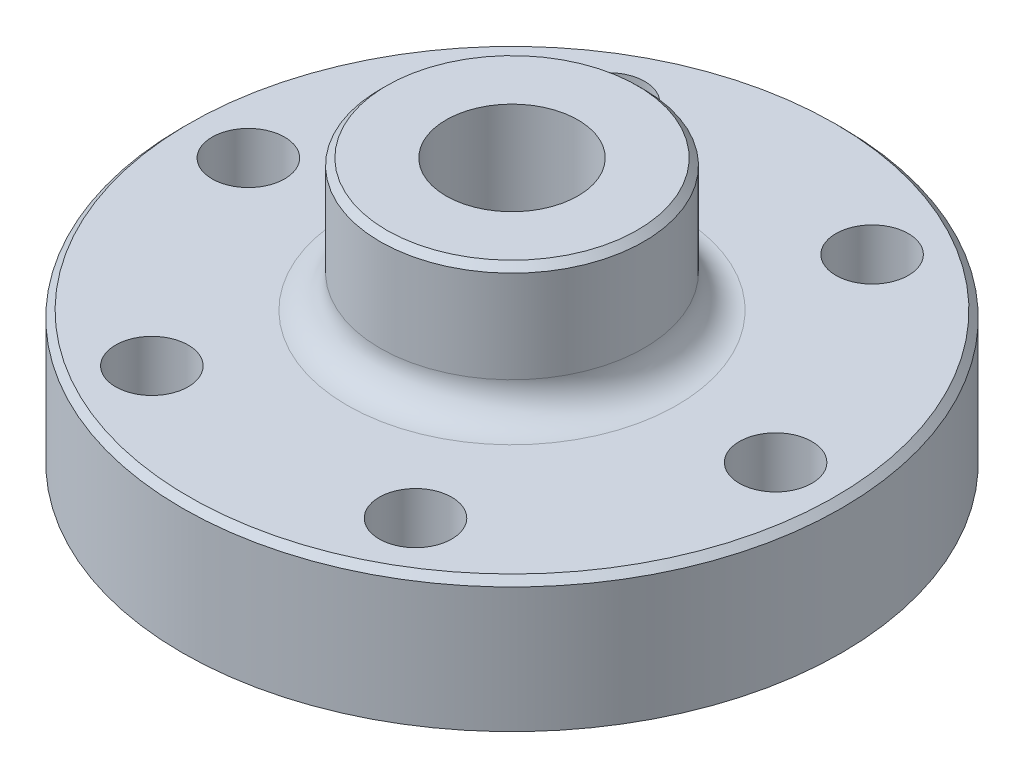
ISO-10303-21;
HEADER;
FILE_DESCRIPTION(('STEP AP214'),'2;1');
FILE_NAME('part.step','',(''),(''),'','','');
FILE_SCHEMA(('AUTOMOTIVE_DESIGN { 1 0 10303 214 1 1 1 1 }'));
ENDSEC;
DATA;
#1=APPLICATION_CONTEXT('core data for automotive mechanical design processes');
#2=APPLICATION_PROTOCOL_DEFINITION('international standard','automotive_design',2000,#1);
#3=PRODUCT_CONTEXT('',#1,'mechanical');
#4=PRODUCT('Part','Part','',(#3));
#5=PRODUCT_RELATED_PRODUCT_CATEGORY('part','',(#4));
#6=PRODUCT_DEFINITION_FORMATION('','',#4);
#7=PRODUCT_DEFINITION_CONTEXT('part definition',#1,'design');
#8=PRODUCT_DEFINITION('design','',#6,#7);
#9=PRODUCT_DEFINITION_SHAPE('','',#8);
#10=(LENGTH_UNIT() NAMED_UNIT(*) SI_UNIT(.MILLI.,.METRE.));
#11=(NAMED_UNIT(*) PLANE_ANGLE_UNIT() SI_UNIT($,.RADIAN.));
#12=(NAMED_UNIT(*) SI_UNIT($,.STERADIAN.) SOLID_ANGLE_UNIT());
#13=UNCERTAINTY_MEASURE_WITH_UNIT(LENGTH_MEASURE(1.E-05),#10,'distance_accuracy_value','');
#14=(GEOMETRIC_REPRESENTATION_CONTEXT(3) GLOBAL_UNCERTAINTY_ASSIGNED_CONTEXT((#13)) GLOBAL_UNIT_ASSIGNED_CONTEXT((#10,
#11,#12)) REPRESENTATION_CONTEXT('',''));
#15=CARTESIAN_POINT('',(0.,0.,0.));
#16=DIRECTION('',(0.,0.,1.));
#17=DIRECTION('',(1.,0.,0.));
#18=AXIS2_PLACEMENT_3D('',#15,#16,#17);
#19=CARTESIAN_POINT('',(0.,698.5,0.));
#20=DIRECTION('',(0.,1.,0.));
#21=DIRECTION('',(0.,0.,1.));
#22=AXIS2_PLACEMENT_3D('',#19,#20,#21);
#23=TOROIDAL_SURFACE('',#22,635.,127.);
#24=CARTESIAN_POINT('',(0.,571.5,0.));
#25=DIRECTION('',(0.,1.,0.));
#26=DIRECTION('',(0.,0.,1.));
#27=AXIS2_PLACEMENT_3D('',#24,#25,#26);
#28=CIRCLE('',#27,635.);
#29=CARTESIAN_POINT('',(0.,571.5,635.));
#30=VERTEX_POINT('',#29);
#31=EDGE_CURVE('E62',#30,#30,#28,.F.);
#32=ORIENTED_EDGE('',*,*,#31,.F.);
#33=EDGE_LOOP('',(#32));
#34=FACE_BOUND('',#33,.T.);
#35=CARTESIAN_POINT('',(0.,698.5,0.));
#36=DIRECTION('',(0.,1.,0.));
#37=DIRECTION('',(0.,0.,1.));
#38=AXIS2_PLACEMENT_3D('',#35,#36,#37);
#39=CIRCLE('',#38,508.);
#40=CARTESIAN_POINT('',(0.,698.5,508.));
#41=VERTEX_POINT('',#40);
#42=EDGE_CURVE('E57',#41,#41,#39,.T.);
#43=ORIENTED_EDGE('',*,*,#42,.F.);
#44=EDGE_LOOP('',(#43));
#45=FACE_BOUND('',#44,.T.);
#46=ADVANCED_FACE('F43',(#34,#45),#23,.F.);
#47=CARTESIAN_POINT('',(0.,571.5,0.));
#48=DIRECTION('',(0.,-1.,0.));
#49=DIRECTION('',(0.,0.,-1.));
#50=AXIS2_PLACEMENT_3D('',#47,#48,#49);
#51=CYLINDRICAL_SURFACE('',#50,1270.);
#52=CARTESIAN_POINT('',(0.,546.1,0.));
#53=DIRECTION('',(0.,1.,0.));
#54=DIRECTION('',(0.,0.,1.));
#55=AXIS2_PLACEMENT_3D('',#52,#53,#54);
#56=CIRCLE('',#55,1270.);
#57=CARTESIAN_POINT('',(0.,546.1,-1270.));
#58=VERTEX_POINT('',#57);
#59=EDGE_CURVE('E68',#58,#58,#56,.F.);
#60=ORIENTED_EDGE('',*,*,#59,.T.);
#61=EDGE_LOOP('',(#60));
#62=FACE_BOUND('',#61,.T.);
#63=CARTESIAN_POINT('',(0.,63.5,0.));
#64=DIRECTION('',(0.,1.,0.));
#65=DIRECTION('',(0.,0.,1.));
#66=AXIS2_PLACEMENT_3D('',#63,#64,#65);
#67=CIRCLE('',#66,1270.);
#68=CARTESIAN_POINT('',(0.,63.5,1270.));
#69=VERTEX_POINT('',#68);
#70=EDGE_CURVE('E115',#69,#69,#67,.T.);
#71=ORIENTED_EDGE('',*,*,#70,.T.);
#72=EDGE_LOOP('',(#71));
#73=FACE_BOUND('',#72,.T.);
#74=ADVANCED_FACE('F160',(#62,#73),#51,.T.);
#75=CARTESIAN_POINT('',(0.,571.5,0.));
#76=DIRECTION('',(0.,1.,0.));
#77=DIRECTION('',(0.,0.,1.));
#78=AXIS2_PLACEMENT_3D('',#75,#76,#77);
#79=PLANE('',#78);
#80=ORIENTED_EDGE('',*,*,#31,.T.);
#81=EDGE_LOOP('',(#80));
#82=FACE_BOUND('',#81,.T.);
#83=CARTESIAN_POINT('',(-1015.47879585485,571.5,2.27281067831809E-11));
#84=DIRECTION('',(0.,1.,0.));
#85=DIRECTION('',(0.,0.,1.));
#86=AXIS2_PLACEMENT_3D('',#83,#84,#85);
#87=CIRCLE('',#86,139.700000000025);
#88=CARTESIAN_POINT('',(-1015.47879585485,571.5,139.700000000048));
#89=VERTEX_POINT('',#88);
#90=EDGE_CURVE('E73',#89,#89,#87,.F.);
#91=ORIENTED_EDGE('',*,*,#90,.T.);
#92=EDGE_LOOP('',(#91));
#93=FACE_BOUND('',#92,.T.);
#94=CARTESIAN_POINT('',(-507.739397927369,571.5,879.430434214766));
#95=DIRECTION('',(0.,1.,0.));
#96=DIRECTION('',(0.,0.,1.));
#97=AXIS2_PLACEMENT_3D('',#94,#95,#96);
#98=CIRCLE('',#97,139.700000000065);
#99=CARTESIAN_POINT('',(-507.739397927369,571.5,1019.13043421483));
#100=VERTEX_POINT('',#99);
#101=EDGE_CURVE('E74',#100,#100,#98,.F.);
#102=ORIENTED_EDGE('',*,*,#101,.T.);
#103=EDGE_LOOP('',(#102));
#104=FACE_BOUND('',#103,.T.);
#105=CARTESIAN_POINT('',(507.73939792752,571.5,879.430434214723));
#106=DIRECTION('',(0.,1.,0.));
#107=DIRECTION('',(0.,0.,1.));
#108=AXIS2_PLACEMENT_3D('',#105,#106,#107);
#109=CIRCLE('',#108,139.700000000092);
#110=CARTESIAN_POINT('',(507.73939792752,571.5,1019.13043421481));
#111=VERTEX_POINT('',#110);
#112=EDGE_CURVE('E79',#111,#111,#109,.F.);
#113=ORIENTED_EDGE('',*,*,#112,.T.);
#114=EDGE_LOOP('',(#113));
#115=FACE_BOUND('',#114,.T.);
#116=CARTESIAN_POINT('',(1015.47879585493,571.5,-6.48055594164743E-11));
#117=DIRECTION('',(0.,1.,0.));
#118=DIRECTION('',(0.,0.,1.));
#119=AXIS2_PLACEMENT_3D('',#116,#117,#118);
#120=CIRCLE('',#119,139.700000000076);
#121=CARTESIAN_POINT('',(1015.47879585493,571.5,139.700000000011));
#122=VERTEX_POINT('',#121);
#123=EDGE_CURVE('E84',#122,#122,#120,.F.);
#124=ORIENTED_EDGE('',*,*,#123,.T.);
#125=EDGE_LOOP('',(#124));
#126=FACE_BOUND('',#125,.T.);
#127=CARTESIAN_POINT('',(507.739397927444,571.5,-879.430434214809));
#128=DIRECTION('',(0.,1.,0.));
#129=DIRECTION('',(0.,0.,1.));
#130=AXIS2_PLACEMENT_3D('',#127,#128,#129);
#131=CIRCLE('',#130,139.700000000032);
#132=CARTESIAN_POINT('',(507.739397927444,571.5,-739.730434214777));
#133=VERTEX_POINT('',#132);
#134=EDGE_CURVE('E89',#133,#133,#131,.F.);
#135=ORIENTED_EDGE('',*,*,#134,.T.);
#136=EDGE_LOOP('',(#135));
#137=FACE_BOUND('',#136,.T.);
#138=CARTESIAN_POINT('',(-507.739397927444,571.5,-879.430434214765));
#139=DIRECTION('',(0.,1.,0.));
#140=DIRECTION('',(0.,0.,1.));
#141=AXIS2_PLACEMENT_3D('',#138,#139,#140);
#142=CIRCLE('',#141,139.7);
#143=CARTESIAN_POINT('',(-507.739397927444,571.5,-739.730434214765));
#144=VERTEX_POINT('',#143);
#145=EDGE_CURVE('E94',#144,#144,#142,.F.);
#146=ORIENTED_EDGE('',*,*,#145,.T.);
#147=EDGE_LOOP('',(#146));
#148=FACE_BOUND('',#147,.T.);
#149=CARTESIAN_POINT('',(0.,571.5,0.));
#150=DIRECTION('',(0.,1.,0.));
#151=DIRECTION('',(0.,0.,1.));
#152=AXIS2_PLACEMENT_3D('',#149,#150,#151);
#153=CIRCLE('',#152,1244.6);
#154=CARTESIAN_POINT('',(0.,571.5,-1244.6));
#155=VERTEX_POINT('',#154);
#156=EDGE_CURVE('E103',#155,#155,#153,.T.);
#157=ORIENTED_EDGE('',*,*,#156,.T.);
#158=EDGE_LOOP('',(#157));
#159=FACE_BOUND('',#158,.T.);
#160=ADVANCED_FACE('F165',(#82,#93,#104,#115,#126,#137,#148,#159),#79,.T.);
#161=CARTESIAN_POINT('',(0.,0.,0.));
#162=DIRECTION('',(0.,1.,0.));
#163=DIRECTION('',(0.,0.,1.));
#164=AXIS2_PLACEMENT_3D('',#161,#162,#163);
#165=CYLINDRICAL_SURFACE('',#164,762.);
#166=CARTESIAN_POINT('',(0.,63.5,0.));
#167=DIRECTION('',(0.,1.,0.));
#168=DIRECTION('',(0.,0.,1.));
#169=AXIS2_PLACEMENT_3D('',#166,#167,#168);
#170=CIRCLE('',#169,762.);
#171=CARTESIAN_POINT('',(0.,63.5,762.));
#172=VERTEX_POINT('',#171);
#173=EDGE_CURVE('E111',#172,#172,#170,.T.);
#174=ORIENTED_EDGE('',*,*,#173,.F.);
#175=EDGE_LOOP('',(#174));
#176=FACE_BOUND('',#175,.T.);
#177=CARTESIAN_POINT('',(0.,0.,0.));
#178=DIRECTION('',(0.,1.,0.));
#179=DIRECTION('',(0.,0.,1.));
#180=AXIS2_PLACEMENT_3D('',#177,#178,#179);
#181=CIRCLE('',#180,762.);
#182=CARTESIAN_POINT('',(0.,0.,762.));
#183=VERTEX_POINT('',#182);
#184=EDGE_CURVE('E107',#183,#183,#181,.T.);
#185=ORIENTED_EDGE('',*,*,#184,.T.);
#186=EDGE_LOOP('',(#185));
#187=FACE_BOUND('',#186,.T.);
#188=ADVANCED_FACE('F186',(#176,#187),#165,.T.);
#189=CARTESIAN_POINT('',(-1270.,63.5,0.));
#190=DIRECTION('',(0.,1.,0.));
#191=DIRECTION('',(0.,0.,1.));
#192=AXIS2_PLACEMENT_3D('',#189,#190,#191);
#193=PLANE('',#192);
#194=CARTESIAN_POINT('',(-1015.47879585485,63.5,2.27281067831809E-11));
#195=DIRECTION('',(0.,1.,0.));
#196=DIRECTION('',(0.,0.,1.));
#197=AXIS2_PLACEMENT_3D('',#194,#195,#196);
#198=CIRCLE('',#197,139.700000000025);
#199=CARTESIAN_POINT('',(-1015.47879585485,63.5,139.700000000048));
#200=VERTEX_POINT('',#199);
#201=EDGE_CURVE('E69',#200,#200,#198,.F.);
#202=ORIENTED_EDGE('',*,*,#201,.F.);
#203=EDGE_LOOP('',(#202));
#204=FACE_BOUND('',#203,.T.);
#205=CARTESIAN_POINT('',(-507.739397927369,63.5,879.430434214766));
#206=DIRECTION('',(0.,1.,0.));
#207=DIRECTION('',(0.,0.,1.));
#208=AXIS2_PLACEMENT_3D('',#205,#206,#207);
#209=CIRCLE('',#208,139.700000000065);
#210=CARTESIAN_POINT('',(-507.739397927369,63.5,1019.13043421483));
#211=VERTEX_POINT('',#210);
#212=EDGE_CURVE('E75',#211,#211,#209,.F.);
#213=ORIENTED_EDGE('',*,*,#212,.F.);
#214=EDGE_LOOP('',(#213));
#215=FACE_BOUND('',#214,.T.);
#216=CARTESIAN_POINT('',(507.73939792752,63.5,879.430434214723));
#217=DIRECTION('',(0.,1.,0.));
#218=DIRECTION('',(0.,0.,1.));
#219=AXIS2_PLACEMENT_3D('',#216,#217,#218);
#220=CIRCLE('',#219,139.700000000092);
#221=CARTESIAN_POINT('',(507.73939792752,63.5,1019.13043421481));
#222=VERTEX_POINT('',#221);
#223=EDGE_CURVE('E80',#222,#222,#220,.F.);
#224=ORIENTED_EDGE('',*,*,#223,.F.);
#225=EDGE_LOOP('',(#224));
#226=FACE_BOUND('',#225,.T.);
#227=CARTESIAN_POINT('',(1015.47879585493,63.5,-6.48055594164743E-11));
#228=DIRECTION('',(0.,1.,0.));
#229=DIRECTION('',(0.,0.,1.));
#230=AXIS2_PLACEMENT_3D('',#227,#228,#229);
#231=CIRCLE('',#230,139.700000000076);
#232=CARTESIAN_POINT('',(1015.47879585493,63.5,139.700000000011));
#233=VERTEX_POINT('',#232);
#234=EDGE_CURVE('E85',#233,#233,#231,.F.);
#235=ORIENTED_EDGE('',*,*,#234,.F.);
#236=EDGE_LOOP('',(#235));
#237=FACE_BOUND('',#236,.T.);
#238=CARTESIAN_POINT('',(507.739397927444,63.5,-879.430434214809));
#239=DIRECTION('',(0.,1.,0.));
#240=DIRECTION('',(0.,0.,1.));
#241=AXIS2_PLACEMENT_3D('',#238,#239,#240);
#242=CIRCLE('',#241,139.700000000032);
#243=CARTESIAN_POINT('',(507.739397927444,63.5,-739.730434214777));
#244=VERTEX_POINT('',#243);
#245=EDGE_CURVE('E90',#244,#244,#242,.F.);
#246=ORIENTED_EDGE('',*,*,#245,.F.);
#247=EDGE_LOOP('',(#246));
#248=FACE_BOUND('',#247,.T.);
#249=CARTESIAN_POINT('',(-507.739397927444,63.5,-879.430434214765));
#250=DIRECTION('',(0.,1.,0.));
#251=DIRECTION('',(0.,0.,1.));
#252=AXIS2_PLACEMENT_3D('',#249,#250,#251);
#253=CIRCLE('',#252,139.7);
#254=CARTESIAN_POINT('',(-507.739397927444,63.5,-739.730434214765));
#255=VERTEX_POINT('',#254);
#256=EDGE_CURVE('E95',#255,#255,#253,.F.);
#257=ORIENTED_EDGE('',*,*,#256,.F.);
#258=EDGE_LOOP('',(#257));
#259=FACE_BOUND('',#258,.T.);
#260=ORIENTED_EDGE('',*,*,#70,.F.);
#261=EDGE_LOOP('',(#260));
#262=FACE_BOUND('',#261,.T.);
#263=ORIENTED_EDGE('',*,*,#173,.T.);
#264=EDGE_LOOP('',(#263));
#265=FACE_BOUND('',#264,.T.);
#266=ADVANCED_FACE('F182',(#204,#215,#226,#237,#248,#259,#262,#265),#193,.F.);
#267=CARTESIAN_POINT('',(0.,0.,0.));
#268=DIRECTION('',(0.,1.,0.));
#269=DIRECTION('',(0.,0.,1.));
#270=AXIS2_PLACEMENT_3D('',#267,#268,#269);
#271=PLANE('',#270);
#272=CARTESIAN_POINT('',(0.,0.,0.));
#273=DIRECTION('',(0.,1.,0.));
#274=DIRECTION('',(0.,0.,1.));
#275=AXIS2_PLACEMENT_3D('',#272,#273,#274);
#276=CIRCLE('',#275,254.);
#277=CARTESIAN_POINT('',(0.,0.,254.));
#278=VERTEX_POINT('',#277);
#279=EDGE_CURVE('E99',#278,#278,#276,.T.);
#280=ORIENTED_EDGE('',*,*,#279,.T.);
#281=EDGE_LOOP('',(#280));
#282=FACE_BOUND('',#281,.T.);
#283=ORIENTED_EDGE('',*,*,#184,.F.);
#284=EDGE_LOOP('',(#283));
#285=FACE_BOUND('',#284,.T.);
#286=ADVANCED_FACE('F177',(#282,#285),#271,.F.);
#287=CARTESIAN_POINT('',(0.,571.5,0.));
#288=DIRECTION('',(0.,-1.,0.));
#289=DIRECTION('',(0.,0.,-1.));
#290=AXIS2_PLACEMENT_3D('',#287,#288,#289);
#291=CONICAL_SURFACE('',#290,1244.6,0.785398163397444);
#292=CARTESIAN_POINT('',(0.,546.1,-1270.));
#293=CARTESIAN_POINT('',(0.,546.364583333333,-1269.73541666667));
#294=CARTESIAN_POINT('',(0.,546.629166666666,-1269.47083333333));
#295=CARTESIAN_POINT('',(0.,547.158333333333,-1268.94166666667));
#296=CARTESIAN_POINT('',(0.,547.422916666667,-1268.67708333333));
#297=CARTESIAN_POINT('',(0.,547.952083333333,-1268.14791666667));
#298=CARTESIAN_POINT('',(0.,548.216666666667,-1267.88333333333));
#299=CARTESIAN_POINT('',(0.,548.745833333333,-1267.35416666667));
#300=CARTESIAN_POINT('',(0.,549.010416666667,-1267.08958333333));
#301=CARTESIAN_POINT('',(0.,549.539583333333,-1266.56041666667));
#302=CARTESIAN_POINT('',(0.,549.804166666667,-1266.29583333333));
#303=CARTESIAN_POINT('',(0.,550.333333333333,-1265.76666666667));
#304=CARTESIAN_POINT('',(0.,550.597916666667,-1265.50208333333));
#305=CARTESIAN_POINT('',(0.,551.127083333333,-1264.97291666667));
#306=CARTESIAN_POINT('',(0.,551.391666666667,-1264.70833333333));
#307=CARTESIAN_POINT('',(0.,551.920833333333,-1264.17916666667));
#308=CARTESIAN_POINT('',(0.,552.185416666667,-1263.91458333333));
#309=CARTESIAN_POINT('',(0.,552.714583333333,-1263.38541666667));
#310=CARTESIAN_POINT('',(0.,552.979166666667,-1263.12083333333));
#311=CARTESIAN_POINT('',(0.,553.508333333333,-1262.59166666667));
#312=CARTESIAN_POINT('',(0.,553.772916666667,-1262.32708333333));
#313=CARTESIAN_POINT('',(0.,554.302083333333,-1261.79791666667));
#314=CARTESIAN_POINT('',(0.,554.566666666666,-1261.53333333333));
#315=CARTESIAN_POINT('',(0.,555.095833333333,-1261.00416666667));
#316=CARTESIAN_POINT('',(0.,555.360416666667,-1260.73958333333));
#317=CARTESIAN_POINT('',(0.,555.889583333333,-1260.21041666667));
#318=CARTESIAN_POINT('',(0.,556.154166666666,-1259.94583333333));
#319=CARTESIAN_POINT('',(0.,556.683333333333,-1259.41666666667));
#320=CARTESIAN_POINT('',(0.,556.947916666667,-1259.15208333333));
#321=CARTESIAN_POINT('',(0.,557.477083333333,-1258.62291666667));
#322=CARTESIAN_POINT('',(0.,557.741666666667,-1258.35833333333));
#323=CARTESIAN_POINT('',(0.,558.270833333333,-1257.82916666667));
#324=CARTESIAN_POINT('',(0.,558.535416666667,-1257.56458333333));
#325=CARTESIAN_POINT('',(0.,559.064583333333,-1257.03541666667));
#326=CARTESIAN_POINT('',(0.,559.329166666667,-1256.77083333333));
#327=CARTESIAN_POINT('',(0.,559.858333333333,-1256.24166666667));
#328=CARTESIAN_POINT('',(0.,560.122916666667,-1255.97708333333));
#329=CARTESIAN_POINT('',(0.,560.652083333333,-1255.44791666667));
#330=CARTESIAN_POINT('',(0.,560.916666666667,-1255.18333333333));
#331=CARTESIAN_POINT('',(0.,561.445833333333,-1254.65416666667));
#332=CARTESIAN_POINT('',(0.,561.710416666667,-1254.38958333333));
#333=CARTESIAN_POINT('',(0.,562.239583333333,-1253.86041666667));
#334=CARTESIAN_POINT('',(0.,562.504166666667,-1253.59583333333));
#335=CARTESIAN_POINT('',(0.,563.033333333333,-1253.06666666667));
#336=CARTESIAN_POINT('',(0.,563.297916666667,-1252.80208333333));
#337=CARTESIAN_POINT('',(0.,563.827083333333,-1252.27291666667));
#338=CARTESIAN_POINT('',(0.,564.091666666667,-1252.00833333333));
#339=CARTESIAN_POINT('',(0.,564.620833333333,-1251.47916666667));
#340=CARTESIAN_POINT('',(0.,564.885416666667,-1251.21458333333));
#341=CARTESIAN_POINT('',(0.,565.414583333333,-1250.68541666667));
#342=CARTESIAN_POINT('',(0.,565.679166666667,-1250.42083333333));
#343=CARTESIAN_POINT('',(0.,566.208333333333,-1249.89166666667));
#344=CARTESIAN_POINT('',(0.,566.472916666666,-1249.62708333333));
#345=CARTESIAN_POINT('',(0.,567.002083333333,-1249.09791666667));
#346=CARTESIAN_POINT('',(0.,567.266666666667,-1248.83333333333));
#347=CARTESIAN_POINT('',(0.,567.795833333333,-1248.30416666667));
#348=CARTESIAN_POINT('',(0.,568.060416666667,-1248.03958333333));
#349=CARTESIAN_POINT('',(0.,568.589583333333,-1247.51041666667));
#350=CARTESIAN_POINT('',(0.,568.854166666667,-1247.24583333333));
#351=CARTESIAN_POINT('',(0.,569.383333333333,-1246.71666666667));
#352=CARTESIAN_POINT('',(0.,569.647916666667,-1246.45208333333));
#353=CARTESIAN_POINT('',(0.,570.177083333333,-1245.92291666667));
#354=CARTESIAN_POINT('',(0.,570.441666666667,-1245.65833333333));
#355=CARTESIAN_POINT('',(0.,570.970833333333,-1245.12916666667));
#356=CARTESIAN_POINT('',(0.,571.235416666667,-1244.86458333333));
#357=CARTESIAN_POINT('',(0.,571.5,-1244.6));
#358=B_SPLINE_CURVE_WITH_KNOTS('',3,(#292,#293,#294,#295,#296,#297,#298,#299,#300,#301,#302,
#303,#304,#305,#306,#307,#308,#309,#310,#311,#312,#313,#314,#315,#316,#317,#318,#319,#320,#321,
#322,#323,#324,#325,#326,#327,#328,#329,#330,#331,#332,#333,#334,#335,#336,#337,#338,#339,#340,
#341,#342,#343,#344,#345,#346,#347,#348,#349,#350,#351,#352,#353,#354,#355,#356,#357),
.UNSPECIFIED.,.F.,.F.,(4,2,2,2,2,2,2,2,2,2,2,2,2,2,2,2,2,2,2,2,2,2,2,2,2,2,2,2,2,2,2,2,4),(0.,
1.12253201513354,2.24506403026716,3.36759604540094,4.49012806053448,5.61266007566809,
6.73519209080187,7.85772410593541,8.98025612106903,10.1027881362028,11.2253201513363,
12.34785216647,13.4703841816037,14.5929161967373,15.7154482118709,16.8379802270045,
17.9605122421383,19.0830442572718,20.2055762724055,21.3281082875392,22.4506403026728,
23.5731723178064,24.6957043329402,25.8182363480737,26.9407683632073,28.0633003783411,
29.1858323934746,30.3083644086083,31.4308964237419,32.5534284388756,33.6759604540092,
34.7984924691428,35.9210244842766),.UNSPECIFIED.);
#359=EDGE_CURVE('BSEAM172',#58,#155,#358,.T.);
#360=ORIENTED_EDGE('',*,*,#59,.F.);
#361=ORIENTED_EDGE('',*,*,#156,.F.);
#362=ORIENTED_EDGE('',*,*,#359,.T.);
#363=ORIENTED_EDGE('',*,*,#359,.F.);
#364=EDGE_LOOP('',(#360,#362,#361,#363));
#365=FACE_BOUND('',#364,.T.);
#366=ADVANCED_FACE('F172',(#365),#291,.T.);
#367=CARTESIAN_POINT('',(-507.739397927444,1016.,-879.430434214765));
#368=DIRECTION('',(0.,-1.,0.));
#369=DIRECTION('',(0.,0.,-1.));
#370=AXIS2_PLACEMENT_3D('',#367,#368,#369);
#371=CYLINDRICAL_SURFACE('',#370,139.7);
#372=ORIENTED_EDGE('',*,*,#145,.F.);
#373=EDGE_LOOP('',(#372));
#374=FACE_BOUND('',#373,.T.);
#375=ORIENTED_EDGE('',*,*,#256,.T.);
#376=EDGE_LOOP('',(#375));
#377=FACE_BOUND('',#376,.T.);
#378=ADVANCED_FACE('F176',(#374,#377),#371,.F.);
#379=CARTESIAN_POINT('',(507.739397927444,1016.,-879.430434214809));
#380=DIRECTION('',(0.,-1.,0.));
#381=DIRECTION('',(0.,0.,-1.));
#382=AXIS2_PLACEMENT_3D('',#379,#380,#381);
#383=CYLINDRICAL_SURFACE('',#382,139.700000000032);
#384=ORIENTED_EDGE('',*,*,#134,.F.);
#385=EDGE_LOOP('',(#384));
#386=FACE_BOUND('',#385,.T.);
#387=ORIENTED_EDGE('',*,*,#245,.T.);
#388=EDGE_LOOP('',(#387));
#389=FACE_BOUND('',#388,.T.);
#390=ADVANCED_FACE('F196',(#386,#389),#383,.F.);
#391=CARTESIAN_POINT('',(1015.47879585493,1016.,-6.48055594164743E-11));
#392=DIRECTION('',(0.,-1.,0.));
#393=DIRECTION('',(0.,0.,-1.));
#394=AXIS2_PLACEMENT_3D('',#391,#392,#393);
#395=CYLINDRICAL_SURFACE('',#394,139.700000000076);
#396=ORIENTED_EDGE('',*,*,#123,.F.);
#397=EDGE_LOOP('',(#396));
#398=FACE_BOUND('',#397,.T.);
#399=ORIENTED_EDGE('',*,*,#234,.T.);
#400=EDGE_LOOP('',(#399));
#401=FACE_BOUND('',#400,.T.);
#402=ADVANCED_FACE('F208',(#398,#401),#395,.F.);
#403=CARTESIAN_POINT('',(507.73939792752,1016.,879.430434214723));
#404=DIRECTION('',(0.,-1.,0.));
#405=DIRECTION('',(0.,0.,-1.));
#406=AXIS2_PLACEMENT_3D('',#403,#404,#405);
#407=CYLINDRICAL_SURFACE('',#406,139.700000000092);
#408=ORIENTED_EDGE('',*,*,#112,.F.);
#409=EDGE_LOOP('',(#408));
#410=FACE_BOUND('',#409,.T.);
#411=ORIENTED_EDGE('',*,*,#223,.T.);
#412=EDGE_LOOP('',(#411));
#413=FACE_BOUND('',#412,.T.);
#414=ADVANCED_FACE('F204',(#410,#413),#407,.F.);
#415=CARTESIAN_POINT('',(-507.739397927369,1016.,879.430434214766));
#416=DIRECTION('',(0.,-1.,0.));
#417=DIRECTION('',(0.,0.,-1.));
#418=AXIS2_PLACEMENT_3D('',#415,#416,#417);
#419=CYLINDRICAL_SURFACE('',#418,139.700000000065);
#420=ORIENTED_EDGE('',*,*,#101,.F.);
#421=EDGE_LOOP('',(#420));
#422=FACE_BOUND('',#421,.T.);
#423=ORIENTED_EDGE('',*,*,#212,.T.);
#424=EDGE_LOOP('',(#423));
#425=FACE_BOUND('',#424,.T.);
#426=ADVANCED_FACE('F200',(#422,#425),#419,.F.);
#427=CARTESIAN_POINT('',(-1015.47879585485,1016.,2.27281067831809E-11));
#428=DIRECTION('',(0.,-1.,0.));
#429=DIRECTION('',(0.,0.,-1.));
#430=AXIS2_PLACEMENT_3D('',#427,#428,#429);
#431=CYLINDRICAL_SURFACE('',#430,139.700000000025);
#432=ORIENTED_EDGE('',*,*,#90,.F.);
#433=EDGE_LOOP('',(#432));
#434=FACE_BOUND('',#433,.T.);
#435=ORIENTED_EDGE('',*,*,#201,.T.);
#436=EDGE_LOOP('',(#435));
#437=FACE_BOUND('',#436,.T.);
#438=ADVANCED_FACE('F156',(#434,#437),#431,.F.);
#439=CARTESIAN_POINT('',(0.,1079.5,0.));
#440=DIRECTION('',(0.,-1.,0.));
#441=DIRECTION('',(0.,0.,-1.));
#442=AXIS2_PLACEMENT_3D('',#439,#440,#441);
#443=CYLINDRICAL_SURFACE('',#442,508.);
#444=CARTESIAN_POINT('',(0.,1054.1,0.));
#445=DIRECTION('',(0.,1.,0.));
#446=DIRECTION('',(0.,0.,1.));
#447=AXIS2_PLACEMENT_3D('',#444,#445,#446);
#448=CIRCLE('',#447,508.);
#449=CARTESIAN_POINT('',(0.,1054.1,508.));
#450=VERTEX_POINT('',#449);
#451=EDGE_CURVE('E10',#450,#450,#448,.F.);
#452=ORIENTED_EDGE('',*,*,#451,.T.);
#453=EDGE_LOOP('',(#452));
#454=FACE_BOUND('',#453,.T.);
#455=ORIENTED_EDGE('',*,*,#42,.T.);
#456=EDGE_LOOP('',(#455));
#457=FACE_BOUND('',#456,.T.);
#458=ADVANCED_FACE('F149',(#454,#457),#443,.T.);
#459=CARTESIAN_POINT('',(0.,1079.5,0.));
#460=DIRECTION('',(0.,1.,0.));
#461=DIRECTION('',(0.,0.,1.));
#462=AXIS2_PLACEMENT_3D('',#459,#460,#461);
#463=PLANE('',#462);
#464=CARTESIAN_POINT('',(0.,1079.5,0.));
#465=DIRECTION('',(0.,1.,0.));
#466=DIRECTION('',(0.,0.,1.));
#467=AXIS2_PLACEMENT_3D('',#464,#465,#466);
#468=CIRCLE('',#467,254.);
#469=CARTESIAN_POINT('',(0.,1079.5,254.));
#470=VERTEX_POINT('',#469);
#471=EDGE_CURVE('E140',#470,#470,#468,.T.);
#472=ORIENTED_EDGE('',*,*,#471,.F.);
#473=EDGE_LOOP('',(#472));
#474=FACE_BOUND('',#473,.T.);
#475=CARTESIAN_POINT('',(0.,1079.5,0.));
#476=DIRECTION('',(0.,1.,0.));
#477=DIRECTION('',(0.,0.,1.));
#478=AXIS2_PLACEMENT_3D('',#475,#476,#477);
#479=CIRCLE('',#478,482.600000000001);
#480=CARTESIAN_POINT('',(0.,1079.5,482.600000000001));
#481=VERTEX_POINT('',#480);
#482=EDGE_CURVE('E52',#481,#481,#479,.T.);
#483=ORIENTED_EDGE('',*,*,#482,.T.);
#484=EDGE_LOOP('',(#483));
#485=FACE_BOUND('',#484,.T.);
#486=ADVANCED_FACE('F147',(#474,#485),#463,.T.);
#487=CARTESIAN_POINT('',(0.,1079.5,0.));
#488=DIRECTION('',(0.,-1.,0.));
#489=DIRECTION('',(0.,0.,-1.));
#490=AXIS2_PLACEMENT_3D('',#487,#488,#489);
#491=CONICAL_SURFACE('',#490,482.600000000001,0.785398163397435);
#492=ORIENTED_EDGE('',*,*,#451,.F.);
#493=EDGE_LOOP('',(#492));
#494=FACE_BOUND('',#493,.T.);
#495=ORIENTED_EDGE('',*,*,#482,.F.);
#496=EDGE_LOOP('',(#495));
#497=FACE_BOUND('',#496,.T.);
#498=ADVANCED_FACE('F46',(#494,#497),#491,.T.);
#499=CARTESIAN_POINT('',(0.,0.,0.));
#500=DIRECTION('',(0.,1.,0.));
#501=DIRECTION('',(0.,0.,1.));
#502=AXIS2_PLACEMENT_3D('',#499,#500,#501);
#503=CYLINDRICAL_SURFACE('',#502,254.);
#504=ORIENTED_EDGE('',*,*,#279,.F.);
#505=EDGE_LOOP('',(#504));
#506=FACE_BOUND('',#505,.T.);
#507=ORIENTED_EDGE('',*,*,#471,.T.);
#508=EDGE_LOOP('',(#507));
#509=FACE_BOUND('',#508,.T.);
#510=ADVANCED_FACE('F145',(#506,#509),#503,.F.);
#511=CLOSED_SHELL('',(#46,#74,#160,#188,#266,#286,#366,#378,#390,#402,#414,#426,#438,#458,#486,
#498,#510));
#512=MANIFOLD_SOLID_BREP('B2',#511);
#513=ADVANCED_BREP_SHAPE_REPRESENTATION('',(#18,#512),#14);
#514=SHAPE_DEFINITION_REPRESENTATION(#9,#513);
ENDSEC;
END-ISO-10303-21;
